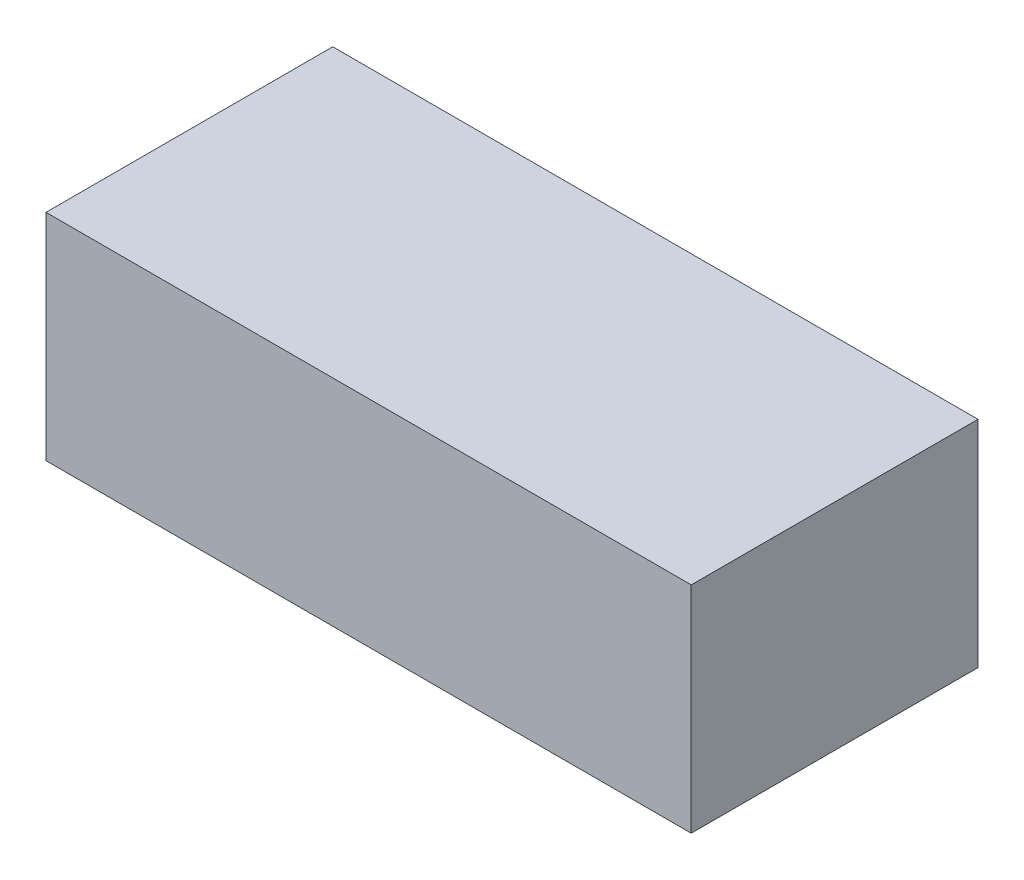
ISO-10303-21;
HEADER;
FILE_DESCRIPTION(('STEP AP214'),'2;1');
FILE_NAME('part.step','',(''),(''),'','','');
FILE_SCHEMA(('AUTOMOTIVE_DESIGN { 1 0 10303 214 1 1 1 1 }'));
ENDSEC;
DATA;
#1=APPLICATION_CONTEXT('core data for automotive mechanical design processes');
#2=APPLICATION_PROTOCOL_DEFINITION('international standard','automotive_design',2000,#1);
#3=PRODUCT_CONTEXT('',#1,'mechanical');
#4=PRODUCT('Part','Part','',(#3));
#5=PRODUCT_RELATED_PRODUCT_CATEGORY('part','',(#4));
#6=PRODUCT_DEFINITION_FORMATION('','',#4);
#7=PRODUCT_DEFINITION_CONTEXT('part definition',#1,'design');
#8=PRODUCT_DEFINITION('design','',#6,#7);
#9=PRODUCT_DEFINITION_SHAPE('','',#8);
#10=(LENGTH_UNIT() NAMED_UNIT(*) SI_UNIT(.MILLI.,.METRE.));
#11=(NAMED_UNIT(*) PLANE_ANGLE_UNIT() SI_UNIT($,.RADIAN.));
#12=(NAMED_UNIT(*) SI_UNIT($,.STERADIAN.) SOLID_ANGLE_UNIT());
#13=UNCERTAINTY_MEASURE_WITH_UNIT(LENGTH_MEASURE(1.E-05),#10,'distance_accuracy_value','');
#14=(GEOMETRIC_REPRESENTATION_CONTEXT(3) GLOBAL_UNCERTAINTY_ASSIGNED_CONTEXT((#13)) GLOBAL_UNIT_ASSIGNED_CONTEXT((#10,
#11,#12)) REPRESENTATION_CONTEXT('',''));
#15=CARTESIAN_POINT('',(0.,0.,0.));
#16=DIRECTION('',(0.,0.,1.));
#17=DIRECTION('',(1.,0.,0.));
#18=AXIS2_PLACEMENT_3D('',#15,#16,#17);
#19=CARTESIAN_POINT('',(0.,0.,0.));
#20=DIRECTION('',(0.,0.,1.));
#21=DIRECTION('',(1.,0.,0.));
#22=AXIS2_PLACEMENT_3D('',#19,#20,#21);
#23=PLANE('',#22);
#24=DIRECTION('',(-1.,0.,0.));
#25=VECTOR('',#24,1.);
#26=CARTESIAN_POINT('',(14.2875,4.76249999999992,0.));
#27=LINE('',#26,#25);
#28=CARTESIAN_POINT('',(14.2875,4.76249999999992,0.));
#29=VERTEX_POINT('',#28);
#30=CARTESIAN_POINT('',(-14.2875,4.76249999999992,0.));
#31=VERTEX_POINT('',#30);
#32=EDGE_CURVE('E26',#29,#31,#27,.T.);
#33=ORIENTED_EDGE('',*,*,#32,.F.);
#34=DIRECTION('',(0.,1.,0.));
#35=VECTOR('',#34,1.);
#36=CARTESIAN_POINT('',(14.2875,-4.7625000000001,0.));
#37=LINE('',#36,#35);
#38=CARTESIAN_POINT('',(14.2875,-4.7625000000001,0.));
#39=VERTEX_POINT('',#38);
#40=EDGE_CURVE('E83',#39,#29,#37,.T.);
#41=ORIENTED_EDGE('',*,*,#40,.F.);
#42=DIRECTION('',(1.,0.,0.));
#43=VECTOR('',#42,1.);
#44=CARTESIAN_POINT('',(-14.2875,-4.7625000000001,0.));
#45=LINE('',#44,#43);
#46=CARTESIAN_POINT('',(-14.2875,-4.7625000000001,0.));
#47=VERTEX_POINT('',#46);
#48=EDGE_CURVE('E65',#47,#39,#45,.T.);
#49=ORIENTED_EDGE('',*,*,#48,.F.);
#50=DIRECTION('',(0.,-1.,0.));
#51=VECTOR('',#50,1.);
#52=CARTESIAN_POINT('',(-14.2875,4.76249999999992,0.));
#53=LINE('',#52,#51);
#54=EDGE_CURVE('E99',#31,#47,#53,.T.);
#55=ORIENTED_EDGE('',*,*,#54,.F.);
#56=EDGE_LOOP('',(#33,#41,#49,#55));
#57=FACE_BOUND('',#56,.T.);
#58=ADVANCED_FACE('F17',(#57),#23,.F.);
#59=CARTESIAN_POINT('',(0.,0.,12.7));
#60=DIRECTION('',(0.,0.,1.));
#61=DIRECTION('',(1.,0.,0.));
#62=AXIS2_PLACEMENT_3D('',#59,#60,#61);
#63=PLANE('',#62);
#64=DIRECTION('',(-1.,0.,0.));
#65=VECTOR('',#64,1.);
#66=CARTESIAN_POINT('',(14.2875,4.76249999999992,12.7));
#67=LINE('',#66,#65);
#68=CARTESIAN_POINT('',(14.2875,4.76249999999992,12.7));
#69=VERTEX_POINT('',#68);
#70=CARTESIAN_POINT('',(-14.2875,4.76249999999992,12.7));
#71=VERTEX_POINT('',#70);
#72=EDGE_CURVE('E11',#69,#71,#67,.T.);
#73=ORIENTED_EDGE('',*,*,#72,.T.);
#74=DIRECTION('',(0.,-1.,0.));
#75=VECTOR('',#74,1.);
#76=CARTESIAN_POINT('',(-14.2875,4.76249999999992,12.7));
#77=LINE('',#76,#75);
#78=CARTESIAN_POINT('',(-14.2875,-4.7625000000001,12.7));
#79=VERTEX_POINT('',#78);
#80=EDGE_CURVE('E102',#71,#79,#77,.T.);
#81=ORIENTED_EDGE('',*,*,#80,.T.);
#82=DIRECTION('',(1.,0.,0.));
#83=VECTOR('',#82,1.);
#84=CARTESIAN_POINT('',(-14.2875,-4.7625000000001,12.7));
#85=LINE('',#84,#83);
#86=CARTESIAN_POINT('',(14.2875,-4.7625000000001,12.7));
#87=VERTEX_POINT('',#86);
#88=EDGE_CURVE('E77',#79,#87,#85,.T.);
#89=ORIENTED_EDGE('',*,*,#88,.T.);
#90=DIRECTION('',(0.,1.,0.));
#91=VECTOR('',#90,1.);
#92=CARTESIAN_POINT('',(14.2875,-4.7625000000001,12.7));
#93=LINE('',#92,#91);
#94=EDGE_CURVE('E84',#87,#69,#93,.T.);
#95=ORIENTED_EDGE('',*,*,#94,.T.);
#96=EDGE_LOOP('',(#73,#81,#89,#95));
#97=FACE_BOUND('',#96,.T.);
#98=ADVANCED_FACE('F120',(#97),#63,.T.);
#99=CARTESIAN_POINT('',(14.2875,4.76249999999992,0.));
#100=DIRECTION('',(0.,1.,0.));
#101=DIRECTION('',(1.,0.,0.));
#102=AXIS2_PLACEMENT_3D('',#99,#100,#101);
#103=PLANE('',#102);
#104=ORIENTED_EDGE('',*,*,#32,.T.);
#105=DIRECTION('',(0.,0.,1.));
#106=VECTOR('',#105,1.);
#107=CARTESIAN_POINT('',(-14.2875,4.76249999999992,0.));
#108=LINE('',#107,#106);
#109=EDGE_CURVE('E109',#31,#71,#108,.T.);
#110=ORIENTED_EDGE('',*,*,#109,.T.);
#111=ORIENTED_EDGE('',*,*,#72,.F.);
#112=DIRECTION('',(0.,0.,1.));
#113=VECTOR('',#112,1.);
#114=CARTESIAN_POINT('',(14.2875,4.76249999999992,0.));
#115=LINE('',#114,#113);
#116=EDGE_CURVE('E89',#29,#69,#115,.T.);
#117=ORIENTED_EDGE('',*,*,#116,.F.);
#118=EDGE_LOOP('',(#104,#110,#111,#117));
#119=FACE_BOUND('',#118,.T.);
#120=ADVANCED_FACE('F116',(#119),#103,.T.);
#121=CARTESIAN_POINT('',(-14.2875,4.76249999999992,0.));
#122=DIRECTION('',(-1.,0.,0.));
#123=DIRECTION('',(0.,0.,1.));
#124=AXIS2_PLACEMENT_3D('',#121,#122,#123);
#125=PLANE('',#124);
#126=ORIENTED_EDGE('',*,*,#54,.T.);
#127=DIRECTION('',(0.,0.,1.));
#128=VECTOR('',#127,1.);
#129=CARTESIAN_POINT('',(-14.2875,-4.7625000000001,0.));
#130=LINE('',#129,#128);
#131=EDGE_CURVE('E72',#47,#79,#130,.T.);
#132=ORIENTED_EDGE('',*,*,#131,.T.);
#133=ORIENTED_EDGE('',*,*,#80,.F.);
#134=ORIENTED_EDGE('',*,*,#109,.F.);
#135=EDGE_LOOP('',(#126,#132,#133,#134));
#136=FACE_BOUND('',#135,.T.);
#137=ADVANCED_FACE('F119',(#136),#125,.T.);
#138=CARTESIAN_POINT('',(-14.2875,-4.7625000000001,0.));
#139=DIRECTION('',(0.,-1.,0.));
#140=DIRECTION('',(0.,0.,-1.));
#141=AXIS2_PLACEMENT_3D('',#138,#139,#140);
#142=PLANE('',#141);
#143=ORIENTED_EDGE('',*,*,#48,.T.);
#144=DIRECTION('',(0.,0.,1.));
#145=VECTOR('',#144,1.);
#146=CARTESIAN_POINT('',(14.2875,-4.7625000000001,0.));
#147=LINE('',#146,#145);
#148=EDGE_CURVE('E69',#39,#87,#147,.T.);
#149=ORIENTED_EDGE('',*,*,#148,.T.);
#150=ORIENTED_EDGE('',*,*,#88,.F.);
#151=ORIENTED_EDGE('',*,*,#131,.F.);
#152=EDGE_LOOP('',(#143,#149,#150,#151));
#153=FACE_BOUND('',#152,.T.);
#154=ADVANCED_FACE('F67',(#153),#142,.T.);
#155=CARTESIAN_POINT('',(14.2875,-4.7625000000001,0.));
#156=DIRECTION('',(1.,0.,0.));
#157=DIRECTION('',(0.,1.,0.));
#158=AXIS2_PLACEMENT_3D('',#155,#156,#157);
#159=PLANE('',#158);
#160=ORIENTED_EDGE('',*,*,#40,.T.);
#161=ORIENTED_EDGE('',*,*,#116,.T.);
#162=ORIENTED_EDGE('',*,*,#94,.F.);
#163=ORIENTED_EDGE('',*,*,#148,.F.);
#164=EDGE_LOOP('',(#160,#161,#162,#163));
#165=FACE_BOUND('',#164,.T.);
#166=ADVANCED_FACE('F81',(#165),#159,.T.);
#167=CLOSED_SHELL('',(#58,#98,#120,#137,#154,#166));
#168=MANIFOLD_SOLID_BREP('B1',#167);
#169=ADVANCED_BREP_SHAPE_REPRESENTATION('',(#18,#168),#14);
#170=SHAPE_DEFINITION_REPRESENTATION(#9,#169);
ENDSEC;
END-ISO-10303-21;
